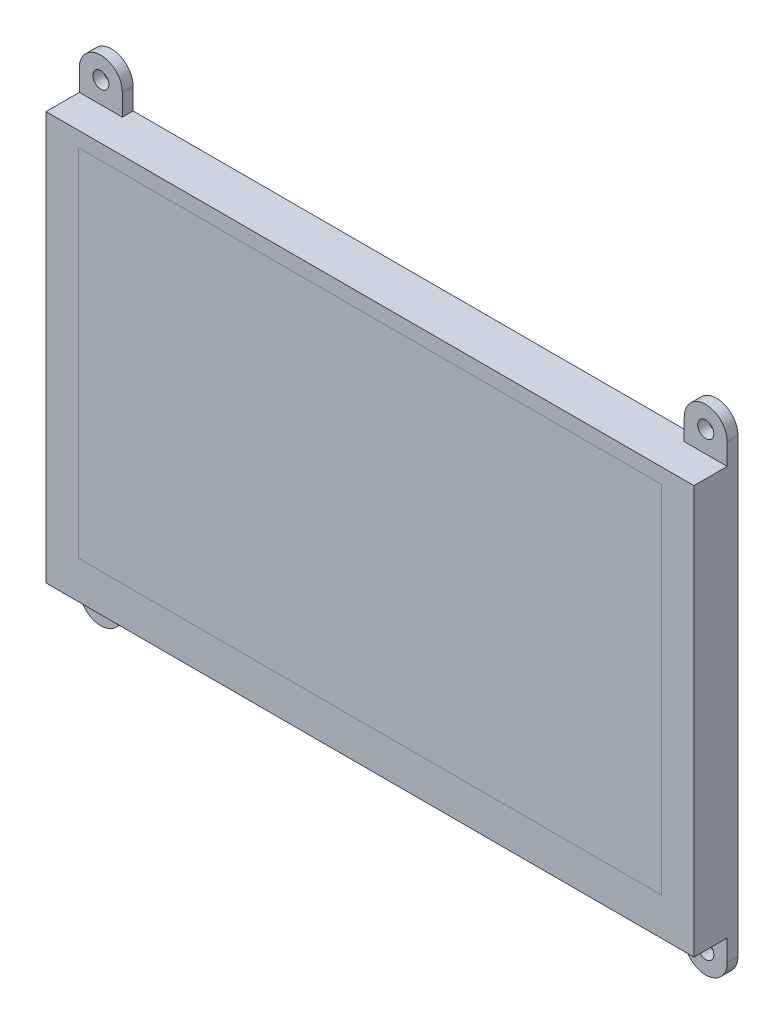
ISO-10303-21;
HEADER;
FILE_DESCRIPTION(('STEP AP214'),'2;1');
FILE_NAME('part.step','',(''),(''),'','','');
FILE_SCHEMA(('AUTOMOTIVE_DESIGN { 1 0 10303 214 1 1 1 1 }'));
ENDSEC;
DATA;
#1=APPLICATION_CONTEXT('core data for automotive mechanical design processes');
#2=APPLICATION_PROTOCOL_DEFINITION('international standard','automotive_design',2000,#1);
#3=PRODUCT_CONTEXT('',#1,'mechanical');
#4=PRODUCT('Part','Part','',(#3));
#5=PRODUCT_RELATED_PRODUCT_CATEGORY('part','',(#4));
#6=PRODUCT_DEFINITION_FORMATION('','',#4);
#7=PRODUCT_DEFINITION_CONTEXT('part definition',#1,'design');
#8=PRODUCT_DEFINITION('design','',#6,#7);
#9=PRODUCT_DEFINITION_SHAPE('','',#8);
#10=(LENGTH_UNIT() NAMED_UNIT(*) SI_UNIT(.MILLI.,.METRE.));
#11=(NAMED_UNIT(*) PLANE_ANGLE_UNIT() SI_UNIT($,.RADIAN.));
#12=(NAMED_UNIT(*) SI_UNIT($,.STERADIAN.) SOLID_ANGLE_UNIT());
#13=UNCERTAINTY_MEASURE_WITH_UNIT(LENGTH_MEASURE(1.E-05),#10,'distance_accuracy_value','');
#14=(GEOMETRIC_REPRESENTATION_CONTEXT(3) GLOBAL_UNCERTAINTY_ASSIGNED_CONTEXT((#13)) GLOBAL_UNIT_ASSIGNED_CONTEXT((#10,
#11,#12)) REPRESENTATION_CONTEXT('',''));
#15=CARTESIAN_POINT('',(0.,0.,0.));
#16=DIRECTION('',(0.,0.,1.));
#17=DIRECTION('',(1.,0.,0.));
#18=AXIS2_PLACEMENT_3D('',#15,#16,#17);
#19=CARTESIAN_POINT('',(0.,0.,8.2));
#20=DIRECTION('',(0.,0.,-1.));
#21=DIRECTION('',(-1.,0.,0.));
#22=AXIS2_PLACEMENT_3D('',#19,#20,#21);
#23=PLANE('',#22);
#24=DIRECTION('',(0.,1.,0.));
#25=VECTOR('',#24,1.);
#26=CARTESIAN_POINT('',(60.3,-38.,8.2));
#27=LINE('',#26,#25);
#28=CARTESIAN_POINT('',(60.3,-38.,8.2));
#29=VERTEX_POINT('',#28);
#30=CARTESIAN_POINT('',(60.3,38.,8.2));
#31=VERTEX_POINT('',#30);
#32=EDGE_CURVE('E171',#29,#31,#27,.T.);
#33=ORIENTED_EDGE('',*,*,#32,.T.);
#34=DIRECTION('',(-1.,0.,0.));
#35=VECTOR('',#34,1.);
#36=CARTESIAN_POINT('',(-60.3,38.,8.2));
#37=LINE('',#36,#35);
#38=CARTESIAN_POINT('',(-60.3,38.,8.2));
#39=VERTEX_POINT('',#38);
#40=EDGE_CURVE('E158',#31,#39,#37,.T.);
#41=ORIENTED_EDGE('',*,*,#40,.T.);
#42=DIRECTION('',(0.,-1.,0.));
#43=VECTOR('',#42,1.);
#44=CARTESIAN_POINT('',(-60.3,-38.,8.2));
#45=LINE('',#44,#43);
#46=CARTESIAN_POINT('',(-60.3,-38.,8.2));
#47=VERTEX_POINT('',#46);
#48=EDGE_CURVE('E170',#39,#47,#45,.T.);
#49=ORIENTED_EDGE('',*,*,#48,.T.);
#50=DIRECTION('',(1.,0.,0.));
#51=VECTOR('',#50,1.);
#52=CARTESIAN_POINT('',(-60.3,-38.,8.2));
#53=LINE('',#52,#51);
#54=EDGE_CURVE('E176',#47,#29,#53,.T.);
#55=ORIENTED_EDGE('',*,*,#54,.T.);
#56=EDGE_LOOP('',(#33,#41,#49,#55));
#57=FACE_BOUND('',#56,.T.);
#58=DIRECTION('',(0.,1.,0.));
#59=VECTOR('',#58,1.);
#60=CARTESIAN_POINT('',(54.3,0.,8.2));
#61=LINE('',#60,#59);
#62=CARTESIAN_POINT('',(54.3,-31.,8.2));
#63=VERTEX_POINT('',#62);
#64=CARTESIAN_POINT('',(54.3,35.2,8.2));
#65=VERTEX_POINT('',#64);
#66=EDGE_CURVE('E11',#63,#65,#61,.T.);
#67=ORIENTED_EDGE('',*,*,#66,.F.);
#68=DIRECTION('',(1.,0.,0.));
#69=VECTOR('',#68,1.);
#70=CARTESIAN_POINT('',(0.,-31.,8.2));
#71=LINE('',#70,#69);
#72=CARTESIAN_POINT('',(-54.3,-31.,8.2));
#73=VERTEX_POINT('',#72);
#74=EDGE_CURVE('E303',#73,#63,#71,.T.);
#75=ORIENTED_EDGE('',*,*,#74,.F.);
#76=DIRECTION('',(0.,-1.,0.));
#77=VECTOR('',#76,1.);
#78=CARTESIAN_POINT('',(-54.3,0.,8.2));
#79=LINE('',#78,#77);
#80=CARTESIAN_POINT('',(-54.3,35.2,8.2));
#81=VERTEX_POINT('',#80);
#82=EDGE_CURVE('E306',#81,#73,#79,.T.);
#83=ORIENTED_EDGE('',*,*,#82,.F.);
#84=DIRECTION('',(-1.,0.,0.));
#85=VECTOR('',#84,1.);
#86=CARTESIAN_POINT('',(0.,35.2,8.2));
#87=LINE('',#86,#85);
#88=EDGE_CURVE('E46',#65,#81,#87,.T.);
#89=ORIENTED_EDGE('',*,*,#88,.F.);
#90=EDGE_LOOP('',(#67,#75,#83,#89));
#91=FACE_BOUND('',#90,.T.);
#92=ADVANCED_FACE('F37',(#57,#91),#23,.F.);
#93=CARTESIAN_POINT('',(0.,0.,2.));
#94=DIRECTION('',(0.,0.,1.));
#95=DIRECTION('',(1.,0.,0.));
#96=AXIS2_PLACEMENT_3D('',#93,#94,#95);
#97=PLANE('',#96);
#98=DIRECTION('',(1.,0.,0.));
#99=VECTOR('',#98,1.);
#100=CARTESIAN_POINT('',(-60.3,-38.,2.));
#101=LINE('',#100,#99);
#102=CARTESIAN_POINT('',(-60.3,-38.,2.));
#103=VERTEX_POINT('',#102);
#104=CARTESIAN_POINT('',(-52.3,-38.,2.));
#105=VERTEX_POINT('',#104);
#106=EDGE_CURVE('E180',#103,#105,#101,.T.);
#107=ORIENTED_EDGE('',*,*,#106,.F.);
#108=DIRECTION('',(0.,1.,0.));
#109=VECTOR('',#108,1.);
#110=CARTESIAN_POINT('',(-60.3,0.,2.));
#111=LINE('',#110,#109);
#112=CARTESIAN_POINT('',(-60.3,-42.,2.));
#113=VERTEX_POINT('',#112);
#114=EDGE_CURVE('E221',#113,#103,#111,.T.);
#115=ORIENTED_EDGE('',*,*,#114,.F.);
#116=CARTESIAN_POINT('',(-56.3,-42.,2.));
#117=DIRECTION('',(0.,0.,1.));
#118=DIRECTION('',(1.,0.,0.));
#119=AXIS2_PLACEMENT_3D('',#116,#117,#118);
#120=CIRCLE('',#119,4.);
#121=CARTESIAN_POINT('',(-52.3,-42.,2.));
#122=VERTEX_POINT('',#121);
#123=EDGE_CURVE('E196',#122,#113,#120,.F.);
#124=ORIENTED_EDGE('',*,*,#123,.F.);
#125=DIRECTION('',(0.,1.,0.));
#126=VECTOR('',#125,1.);
#127=CARTESIAN_POINT('',(-52.3000000000001,-1.81452075587175E-13,2.));
#128=LINE('',#127,#126);
#129=EDGE_CURVE('E199',#122,#105,#128,.T.);
#130=ORIENTED_EDGE('',*,*,#129,.T.);
#131=EDGE_LOOP('',(#107,#115,#124,#130));
#132=FACE_BOUND('',#131,.T.);
#133=CARTESIAN_POINT('',(-56.3,-42.,2.));
#134=DIRECTION('',(0.,0.,1.));
#135=DIRECTION('',(1.,0.,0.));
#136=AXIS2_PLACEMENT_3D('',#133,#134,#135);
#137=CIRCLE('',#136,1.5);
#138=CARTESIAN_POINT('',(-54.8,-42.,2.));
#139=VERTEX_POINT('',#138);
#140=EDGE_CURVE('E230',#139,#139,#137,.F.);
#141=ORIENTED_EDGE('',*,*,#140,.T.);
#142=EDGE_LOOP('',(#141));
#143=FACE_BOUND('',#142,.T.);
#144=ADVANCED_FACE('F321',(#132,#143),#97,.T.);
#145=CARTESIAN_POINT('',(52.3,-38.,2.));
#146=VERTEX_POINT('',#145);
#147=CARTESIAN_POINT('',(60.3,-38.,2.));
#148=VERTEX_POINT('',#147);
#149=EDGE_CURVE('E307',#146,#148,#101,.T.);
#150=ORIENTED_EDGE('',*,*,#149,.F.);
#151=DIRECTION('',(0.,1.,0.));
#152=VECTOR('',#151,1.);
#153=CARTESIAN_POINT('',(52.3000000000002,-1.81452075587175E-13,2.));
#154=LINE('',#153,#152);
#155=CARTESIAN_POINT('',(52.3,-42.,2.));
#156=VERTEX_POINT('',#155);
#157=EDGE_CURVE('E202',#156,#146,#154,.T.);
#158=ORIENTED_EDGE('',*,*,#157,.F.);
#159=CARTESIAN_POINT('',(56.3,-42.,2.));
#160=DIRECTION('',(0.,0.,1.));
#161=DIRECTION('',(1.,0.,0.));
#162=AXIS2_PLACEMENT_3D('',#159,#160,#161);
#163=CIRCLE('',#162,4.);
#164=CARTESIAN_POINT('',(60.3,-42.,2.));
#165=VERTEX_POINT('',#164);
#166=EDGE_CURVE('E205',#156,#165,#163,.T.);
#167=ORIENTED_EDGE('',*,*,#166,.T.);
#168=DIRECTION('',(0.,1.,0.));
#169=VECTOR('',#168,1.);
#170=CARTESIAN_POINT('',(60.3,0.,2.));
#171=LINE('',#170,#169);
#172=EDGE_CURVE('E207',#165,#148,#171,.T.);
#173=ORIENTED_EDGE('',*,*,#172,.T.);
#174=EDGE_LOOP('',(#150,#158,#167,#173));
#175=FACE_BOUND('',#174,.T.);
#176=CARTESIAN_POINT('',(56.3,-42.,2.));
#177=DIRECTION('',(0.,0.,1.));
#178=DIRECTION('',(1.,0.,0.));
#179=AXIS2_PLACEMENT_3D('',#176,#177,#178);
#180=CIRCLE('',#179,1.5);
#181=CARTESIAN_POINT('',(57.8,-42.,2.));
#182=VERTEX_POINT('',#181);
#183=EDGE_CURVE('E233',#182,#182,#180,.T.);
#184=ORIENTED_EDGE('',*,*,#183,.F.);
#185=EDGE_LOOP('',(#184));
#186=FACE_BOUND('',#185,.T.);
#187=ADVANCED_FACE('F326',(#175,#186),#97,.T.);
#188=DIRECTION('',(-1.,0.,0.));
#189=VECTOR('',#188,1.);
#190=CARTESIAN_POINT('',(-60.3,38.,2.));
#191=LINE('',#190,#189);
#192=CARTESIAN_POINT('',(60.3,38.,2.));
#193=VERTEX_POINT('',#192);
#194=CARTESIAN_POINT('',(52.3,38.,2.));
#195=VERTEX_POINT('',#194);
#196=EDGE_CURVE('E423',#193,#195,#191,.T.);
#197=ORIENTED_EDGE('',*,*,#196,.F.);
#198=CARTESIAN_POINT('',(60.3,42.,2.));
#199=VERTEX_POINT('',#198);
#200=EDGE_CURVE('E186',#193,#199,#171,.T.);
#201=ORIENTED_EDGE('',*,*,#200,.T.);
#202=CARTESIAN_POINT('',(56.3,42.,2.));
#203=DIRECTION('',(0.,0.,1.));
#204=DIRECTION('',(1.,0.,0.));
#205=AXIS2_PLACEMENT_3D('',#202,#203,#204);
#206=CIRCLE('',#205,4.);
#207=CARTESIAN_POINT('',(52.3,42.,2.));
#208=VERTEX_POINT('',#207);
#209=EDGE_CURVE('E209',#208,#199,#206,.F.);
#210=ORIENTED_EDGE('',*,*,#209,.F.);
#211=DIRECTION('',(0.,-1.,0.));
#212=VECTOR('',#211,1.);
#213=CARTESIAN_POINT('',(52.3000000000002,1.81452075587175E-13,2.));
#214=LINE('',#213,#212);
#215=EDGE_CURVE('E212',#208,#195,#214,.T.);
#216=ORIENTED_EDGE('',*,*,#215,.T.);
#217=EDGE_LOOP('',(#197,#201,#210,#216));
#218=FACE_BOUND('',#217,.T.);
#219=CARTESIAN_POINT('',(56.3,42.,2.));
#220=DIRECTION('',(0.,0.,1.));
#221=DIRECTION('',(1.,0.,0.));
#222=AXIS2_PLACEMENT_3D('',#219,#220,#221);
#223=CIRCLE('',#222,1.5);
#224=CARTESIAN_POINT('',(57.8,42.,2.));
#225=VERTEX_POINT('',#224);
#226=EDGE_CURVE('E227',#225,#225,#223,.F.);
#227=ORIENTED_EDGE('',*,*,#226,.T.);
#228=EDGE_LOOP('',(#227));
#229=FACE_BOUND('',#228,.T.);
#230=ADVANCED_FACE('F342',(#218,#229),#97,.T.);
#231=CARTESIAN_POINT('',(-56.3,-42.,2.));
#232=DIRECTION('',(0.,0.,-1.));
#233=DIRECTION('',(-1.,0.,0.));
#234=AXIS2_PLACEMENT_3D('',#231,#232,#233);
#235=CYLINDRICAL_SURFACE('',#234,4.);
#236=CARTESIAN_POINT('',(-56.3,-42.,0.));
#237=DIRECTION('',(0.,0.,1.));
#238=DIRECTION('',(1.,0.,0.));
#239=AXIS2_PLACEMENT_3D('',#236,#237,#238);
#240=CIRCLE('',#239,4.);
#241=CARTESIAN_POINT('',(-52.3,-42.,0.));
#242=VERTEX_POINT('',#241);
#243=CARTESIAN_POINT('',(-60.3,-42.,0.));
#244=VERTEX_POINT('',#243);
#245=EDGE_CURVE('E187',#242,#244,#240,.F.);
#246=ORIENTED_EDGE('',*,*,#245,.F.);
#247=DIRECTION('',(0.,0.,-1.));
#248=VECTOR('',#247,1.);
#249=CARTESIAN_POINT('',(-52.3,-42.,2.));
#250=LINE('',#249,#248);
#251=EDGE_CURVE('E300',#122,#242,#250,.T.);
#252=ORIENTED_EDGE('',*,*,#251,.F.);
#253=ORIENTED_EDGE('',*,*,#123,.T.);
#254=DIRECTION('',(0.,0.,-1.));
#255=VECTOR('',#254,1.);
#256=CARTESIAN_POINT('',(-60.3,-42.,2.));
#257=LINE('',#256,#255);
#258=EDGE_CURVE('E235',#113,#244,#257,.T.);
#259=ORIENTED_EDGE('',*,*,#258,.T.);
#260=EDGE_LOOP('',(#246,#252,#253,#259));
#261=FACE_BOUND('',#260,.T.);
#262=ADVANCED_FACE('F39',(#261),#235,.T.);
#263=CARTESIAN_POINT('',(-52.3000000000001,-1.81452075587175E-13,2.));
#264=DIRECTION('',(-1.,0.,0.));
#265=DIRECTION('',(0.,-1.,0.));
#266=AXIS2_PLACEMENT_3D('',#263,#264,#265);
#267=PLANE('',#266);
#268=DIRECTION('',(0.,1.,0.));
#269=VECTOR('',#268,1.);
#270=CARTESIAN_POINT('',(-52.3000000000001,-1.81452075587175E-13,0.));
#271=LINE('',#270,#269);
#272=CARTESIAN_POINT('',(-52.3,-38.,0.));
#273=VERTEX_POINT('',#272);
#274=EDGE_CURVE('E190',#242,#273,#271,.T.);
#275=ORIENTED_EDGE('',*,*,#274,.T.);
#276=DIRECTION('',(0.,0.,-1.));
#277=VECTOR('',#276,1.);
#278=CARTESIAN_POINT('',(-52.3,-38.,2.));
#279=LINE('',#278,#277);
#280=EDGE_CURVE('E297',#105,#273,#279,.T.);
#281=ORIENTED_EDGE('',*,*,#280,.F.);
#282=ORIENTED_EDGE('',*,*,#129,.F.);
#283=ORIENTED_EDGE('',*,*,#251,.T.);
#284=EDGE_LOOP('',(#275,#281,#282,#283));
#285=FACE_BOUND('',#284,.T.);
#286=ADVANCED_FACE('F394',(#285),#267,.F.);
#287=CARTESIAN_POINT('',(0.,-38.,2.));
#288=DIRECTION('',(0.,1.,0.));
#289=DIRECTION('',(0.,0.,1.));
#290=AXIS2_PLACEMENT_3D('',#287,#288,#289);
#291=PLANE('',#290);
#292=DIRECTION('',(1.,0.,0.));
#293=VECTOR('',#292,1.);
#294=CARTESIAN_POINT('',(0.,-38.,0.));
#295=LINE('',#294,#293);
#296=CARTESIAN_POINT('',(52.3,-38.,0.));
#297=VERTEX_POINT('',#296);
#298=EDGE_CURVE('E238',#273,#297,#295,.T.);
#299=ORIENTED_EDGE('',*,*,#298,.T.);
#300=DIRECTION('',(0.,0.,-1.));
#301=VECTOR('',#300,1.);
#302=CARTESIAN_POINT('',(52.3,-38.,2.));
#303=LINE('',#302,#301);
#304=EDGE_CURVE('E295',#146,#297,#303,.T.);
#305=ORIENTED_EDGE('',*,*,#304,.F.);
#306=ORIENTED_EDGE('',*,*,#149,.T.);
#307=DIRECTION('',(0.,0.,-1.));
#308=VECTOR('',#307,1.);
#309=CARTESIAN_POINT('',(60.3,-38.,8.2));
#310=LINE('',#309,#308);
#311=EDGE_CURVE('E416',#29,#148,#310,.T.);
#312=ORIENTED_EDGE('',*,*,#311,.F.);
#313=ORIENTED_EDGE('',*,*,#54,.F.);
#314=DIRECTION('',(0.,0.,-1.));
#315=VECTOR('',#314,1.);
#316=CARTESIAN_POINT('',(-60.3,-38.,8.2));
#317=LINE('',#316,#315);
#318=EDGE_CURVE('E192',#47,#103,#317,.T.);
#319=ORIENTED_EDGE('',*,*,#318,.T.);
#320=ORIENTED_EDGE('',*,*,#106,.T.);
#321=ORIENTED_EDGE('',*,*,#280,.T.);
#322=EDGE_LOOP('',(#299,#305,#306,#312,#313,#319,#320,#321));
#323=FACE_BOUND('',#322,.T.);
#324=ADVANCED_FACE('F391',(#323),#291,.F.);
#325=CARTESIAN_POINT('',(52.3000000000002,-1.81452075587175E-13,2.));
#326=DIRECTION('',(-1.,0.,0.));
#327=DIRECTION('',(0.,-1.,0.));
#328=AXIS2_PLACEMENT_3D('',#325,#326,#327);
#329=PLANE('',#328);
#330=DIRECTION('',(0.,1.,0.));
#331=VECTOR('',#330,1.);
#332=CARTESIAN_POINT('',(52.3000000000002,-1.81452075587175E-13,0.));
#333=LINE('',#332,#331);
#334=CARTESIAN_POINT('',(52.3,-42.,0.));
#335=VERTEX_POINT('',#334);
#336=EDGE_CURVE('E241',#335,#297,#333,.T.);
#337=ORIENTED_EDGE('',*,*,#336,.F.);
#338=DIRECTION('',(0.,0.,-1.));
#339=VECTOR('',#338,1.);
#340=CARTESIAN_POINT('',(52.3,-42.,2.));
#341=LINE('',#340,#339);
#342=EDGE_CURVE('E293',#156,#335,#341,.T.);
#343=ORIENTED_EDGE('',*,*,#342,.F.);
#344=ORIENTED_EDGE('',*,*,#157,.T.);
#345=ORIENTED_EDGE('',*,*,#304,.T.);
#346=EDGE_LOOP('',(#337,#343,#344,#345));
#347=FACE_BOUND('',#346,.T.);
#348=ADVANCED_FACE('F387',(#347),#329,.T.);
#349=CARTESIAN_POINT('',(56.3,-42.,2.));
#350=DIRECTION('',(0.,0.,-1.));
#351=DIRECTION('',(-1.,0.,0.));
#352=AXIS2_PLACEMENT_3D('',#349,#350,#351);
#353=CYLINDRICAL_SURFACE('',#352,4.);
#354=CARTESIAN_POINT('',(56.3,-42.,0.));
#355=DIRECTION('',(0.,0.,1.));
#356=DIRECTION('',(1.,0.,0.));
#357=AXIS2_PLACEMENT_3D('',#354,#355,#356);
#358=CIRCLE('',#357,4.);
#359=CARTESIAN_POINT('',(60.3,-42.,0.));
#360=VERTEX_POINT('',#359);
#361=EDGE_CURVE('E244',#335,#360,#358,.T.);
#362=ORIENTED_EDGE('',*,*,#361,.T.);
#363=DIRECTION('',(0.,0.,-1.));
#364=VECTOR('',#363,1.);
#365=CARTESIAN_POINT('',(60.3,-42.,2.));
#366=LINE('',#365,#364);
#367=EDGE_CURVE('E290',#165,#360,#366,.T.);
#368=ORIENTED_EDGE('',*,*,#367,.F.);
#369=ORIENTED_EDGE('',*,*,#166,.F.);
#370=ORIENTED_EDGE('',*,*,#342,.T.);
#371=EDGE_LOOP('',(#362,#368,#369,#370));
#372=FACE_BOUND('',#371,.T.);
#373=ADVANCED_FACE('F384',(#372),#353,.T.);
#374=CARTESIAN_POINT('',(60.3,0.,2.));
#375=DIRECTION('',(-1.,0.,0.));
#376=DIRECTION('',(0.,0.,1.));
#377=AXIS2_PLACEMENT_3D('',#374,#375,#376);
#378=PLANE('',#377);
#379=DIRECTION('',(0.,1.,0.));
#380=VECTOR('',#379,1.);
#381=CARTESIAN_POINT('',(60.3,0.,0.));
#382=LINE('',#381,#380);
#383=CARTESIAN_POINT('',(60.3,42.,0.));
#384=VERTEX_POINT('',#383);
#385=EDGE_CURVE('E246',#360,#384,#382,.T.);
#386=ORIENTED_EDGE('',*,*,#385,.T.);
#387=DIRECTION('',(0.,0.,-1.));
#388=VECTOR('',#387,1.);
#389=CARTESIAN_POINT('',(60.3,42.,2.));
#390=LINE('',#389,#388);
#391=EDGE_CURVE('E288',#199,#384,#390,.T.);
#392=ORIENTED_EDGE('',*,*,#391,.F.);
#393=ORIENTED_EDGE('',*,*,#200,.F.);
#394=DIRECTION('',(0.,0.,-1.));
#395=VECTOR('',#394,1.);
#396=CARTESIAN_POINT('',(60.3,38.,8.2));
#397=LINE('',#396,#395);
#398=EDGE_CURVE('E164',#31,#193,#397,.T.);
#399=ORIENTED_EDGE('',*,*,#398,.F.);
#400=ORIENTED_EDGE('',*,*,#32,.F.);
#401=ORIENTED_EDGE('',*,*,#311,.T.);
#402=ORIENTED_EDGE('',*,*,#172,.F.);
#403=ORIENTED_EDGE('',*,*,#367,.T.);
#404=EDGE_LOOP('',(#386,#392,#393,#399,#400,#401,#402,#403));
#405=FACE_BOUND('',#404,.T.);
#406=ADVANCED_FACE('F184',(#405),#378,.F.);
#407=CARTESIAN_POINT('',(56.3,42.,2.));
#408=DIRECTION('',(0.,0.,-1.));
#409=DIRECTION('',(-1.,0.,0.));
#410=AXIS2_PLACEMENT_3D('',#407,#408,#409);
#411=CYLINDRICAL_SURFACE('',#410,4.);
#412=CARTESIAN_POINT('',(56.3,42.,0.));
#413=DIRECTION('',(0.,0.,1.));
#414=DIRECTION('',(1.,0.,0.));
#415=AXIS2_PLACEMENT_3D('',#412,#413,#414);
#416=CIRCLE('',#415,4.);
#417=CARTESIAN_POINT('',(52.3,42.,0.));
#418=VERTEX_POINT('',#417);
#419=EDGE_CURVE('E248',#418,#384,#416,.F.);
#420=ORIENTED_EDGE('',*,*,#419,.F.);
#421=DIRECTION('',(0.,0.,-1.));
#422=VECTOR('',#421,1.);
#423=CARTESIAN_POINT('',(52.3,42.,2.));
#424=LINE('',#423,#422);
#425=EDGE_CURVE('E286',#208,#418,#424,.T.);
#426=ORIENTED_EDGE('',*,*,#425,.F.);
#427=ORIENTED_EDGE('',*,*,#209,.T.);
#428=ORIENTED_EDGE('',*,*,#391,.T.);
#429=EDGE_LOOP('',(#420,#426,#427,#428));
#430=FACE_BOUND('',#429,.T.);
#431=ADVANCED_FACE('F377',(#430),#411,.T.);
#432=CARTESIAN_POINT('',(52.3000000000002,1.81452075587175E-13,2.));
#433=DIRECTION('',(1.,0.,0.));
#434=DIRECTION('',(0.,1.,0.));
#435=AXIS2_PLACEMENT_3D('',#432,#433,#434);
#436=PLANE('',#435);
#437=DIRECTION('',(0.,-1.,0.));
#438=VECTOR('',#437,1.);
#439=CARTESIAN_POINT('',(52.3000000000002,1.81452075587175E-13,0.));
#440=LINE('',#439,#438);
#441=CARTESIAN_POINT('',(52.3,38.,0.));
#442=VERTEX_POINT('',#441);
#443=EDGE_CURVE('E251',#418,#442,#440,.T.);
#444=ORIENTED_EDGE('',*,*,#443,.T.);
#445=DIRECTION('',(0.,0.,-1.));
#446=VECTOR('',#445,1.);
#447=CARTESIAN_POINT('',(52.3,38.,2.));
#448=LINE('',#447,#446);
#449=EDGE_CURVE('E284',#195,#442,#448,.T.);
#450=ORIENTED_EDGE('',*,*,#449,.F.);
#451=ORIENTED_EDGE('',*,*,#215,.F.);
#452=ORIENTED_EDGE('',*,*,#425,.T.);
#453=EDGE_LOOP('',(#444,#450,#451,#452));
#454=FACE_BOUND('',#453,.T.);
#455=ADVANCED_FACE('F374',(#454),#436,.F.);
#456=CARTESIAN_POINT('',(0.,38.,2.));
#457=DIRECTION('',(0.,1.,0.));
#458=DIRECTION('',(0.,0.,1.));
#459=AXIS2_PLACEMENT_3D('',#456,#457,#458);
#460=PLANE('',#459);
#461=DIRECTION('',(1.,0.,0.));
#462=VECTOR('',#461,1.);
#463=CARTESIAN_POINT('',(0.,38.,0.));
#464=LINE('',#463,#462);
#465=CARTESIAN_POINT('',(-52.3,38.,0.));
#466=VERTEX_POINT('',#465);
#467=EDGE_CURVE('E254',#466,#442,#464,.T.);
#468=ORIENTED_EDGE('',*,*,#467,.F.);
#469=DIRECTION('',(0.,0.,-1.));
#470=VECTOR('',#469,1.);
#471=CARTESIAN_POINT('',(-52.3,38.,2.));
#472=LINE('',#471,#470);
#473=CARTESIAN_POINT('',(-52.3,38.,2.));
#474=VERTEX_POINT('',#473);
#475=EDGE_CURVE('E282',#474,#466,#472,.T.);
#476=ORIENTED_EDGE('',*,*,#475,.F.);
#477=CARTESIAN_POINT('',(-60.3,38.,2.));
#478=VERTEX_POINT('',#477);
#479=EDGE_CURVE('E302',#474,#478,#191,.T.);
#480=ORIENTED_EDGE('',*,*,#479,.T.);
#481=DIRECTION('',(0.,0.,-1.));
#482=VECTOR('',#481,1.);
#483=CARTESIAN_POINT('',(-60.3,38.,8.2));
#484=LINE('',#483,#482);
#485=EDGE_CURVE('E167',#39,#478,#484,.T.);
#486=ORIENTED_EDGE('',*,*,#485,.F.);
#487=ORIENTED_EDGE('',*,*,#40,.F.);
#488=ORIENTED_EDGE('',*,*,#398,.T.);
#489=ORIENTED_EDGE('',*,*,#196,.T.);
#490=ORIENTED_EDGE('',*,*,#449,.T.);
#491=EDGE_LOOP('',(#468,#476,#480,#486,#487,#488,#489,#490));
#492=FACE_BOUND('',#491,.T.);
#493=ADVANCED_FACE('F161',(#492),#460,.T.);
#494=CARTESIAN_POINT('',(-52.3000000000001,1.81452075587175E-13,2.));
#495=DIRECTION('',(1.,0.,0.));
#496=DIRECTION('',(0.,1.,0.));
#497=AXIS2_PLACEMENT_3D('',#494,#495,#496);
#498=PLANE('',#497);
#499=DIRECTION('',(0.,-1.,0.));
#500=VECTOR('',#499,1.);
#501=CARTESIAN_POINT('',(-52.3000000000001,1.81452075587175E-13,0.));
#502=LINE('',#501,#500);
#503=CARTESIAN_POINT('',(-52.3,42.,0.));
#504=VERTEX_POINT('',#503);
#505=EDGE_CURVE('E257',#504,#466,#502,.T.);
#506=ORIENTED_EDGE('',*,*,#505,.F.);
#507=DIRECTION('',(0.,0.,-1.));
#508=VECTOR('',#507,1.);
#509=CARTESIAN_POINT('',(-52.3,42.,2.));
#510=LINE('',#509,#508);
#511=CARTESIAN_POINT('',(-52.3,42.,2.));
#512=VERTEX_POINT('',#511);
#513=EDGE_CURVE('E280',#512,#504,#510,.T.);
#514=ORIENTED_EDGE('',*,*,#513,.F.);
#515=DIRECTION('',(0.,-1.,0.));
#516=VECTOR('',#515,1.);
#517=CARTESIAN_POINT('',(-52.3000000000001,1.81452075587175E-13,2.));
#518=LINE('',#517,#516);
#519=EDGE_CURVE('E214',#512,#474,#518,.T.);
#520=ORIENTED_EDGE('',*,*,#519,.T.);
#521=ORIENTED_EDGE('',*,*,#475,.T.);
#522=EDGE_LOOP('',(#506,#514,#520,#521));
#523=FACE_BOUND('',#522,.T.);
#524=ADVANCED_FACE('F367',(#523),#498,.T.);
#525=CARTESIAN_POINT('',(-56.3,42.,2.));
#526=DIRECTION('',(0.,0.,-1.));
#527=DIRECTION('',(-1.,0.,0.));
#528=AXIS2_PLACEMENT_3D('',#525,#526,#527);
#529=CYLINDRICAL_SURFACE('',#528,4.);
#530=CARTESIAN_POINT('',(-56.3,42.,0.));
#531=DIRECTION('',(0.,0.,1.));
#532=DIRECTION('',(1.,0.,0.));
#533=AXIS2_PLACEMENT_3D('',#530,#531,#532);
#534=CIRCLE('',#533,4.);
#535=CARTESIAN_POINT('',(-60.3,42.,0.));
#536=VERTEX_POINT('',#535);
#537=EDGE_CURVE('E260',#504,#536,#534,.T.);
#538=ORIENTED_EDGE('',*,*,#537,.T.);
#539=DIRECTION('',(0.,0.,-1.));
#540=VECTOR('',#539,1.);
#541=CARTESIAN_POINT('',(-60.3,42.,2.));
#542=LINE('',#541,#540);
#543=CARTESIAN_POINT('',(-60.3,42.,2.));
#544=VERTEX_POINT('',#543);
#545=EDGE_CURVE('E278',#544,#536,#542,.T.);
#546=ORIENTED_EDGE('',*,*,#545,.F.);
#547=CARTESIAN_POINT('',(-56.3,42.,2.));
#548=DIRECTION('',(0.,0.,1.));
#549=DIRECTION('',(1.,0.,0.));
#550=AXIS2_PLACEMENT_3D('',#547,#548,#549);
#551=CIRCLE('',#550,4.);
#552=EDGE_CURVE('E217',#512,#544,#551,.T.);
#553=ORIENTED_EDGE('',*,*,#552,.F.);
#554=ORIENTED_EDGE('',*,*,#513,.T.);
#555=EDGE_LOOP('',(#538,#546,#553,#554));
#556=FACE_BOUND('',#555,.T.);
#557=ADVANCED_FACE('F353',(#556),#529,.T.);
#558=CARTESIAN_POINT('',(-56.3,-42.,2.));
#559=DIRECTION('',(0.,0.,-1.));
#560=DIRECTION('',(-1.,0.,0.));
#561=AXIS2_PLACEMENT_3D('',#558,#559,#560);
#562=CYLINDRICAL_SURFACE('',#561,1.5);
#563=ORIENTED_EDGE('',*,*,#140,.F.);
#564=EDGE_LOOP('',(#563));
#565=FACE_BOUND('',#564,.T.);
#566=CARTESIAN_POINT('',(-56.3,-42.,0.));
#567=DIRECTION('',(0.,0.,1.));
#568=DIRECTION('',(1.,0.,0.));
#569=AXIS2_PLACEMENT_3D('',#566,#567,#568);
#570=CIRCLE('',#569,1.5);
#571=CARTESIAN_POINT('',(-54.8,-42.,0.));
#572=VERTEX_POINT('',#571);
#573=EDGE_CURVE('E272',#572,#572,#570,.F.);
#574=ORIENTED_EDGE('',*,*,#573,.T.);
#575=EDGE_LOOP('',(#574));
#576=FACE_BOUND('',#575,.T.);
#577=ADVANCED_FACE('F349',(#565,#576),#562,.F.);
#578=CARTESIAN_POINT('',(56.3,42.,2.));
#579=DIRECTION('',(0.,0.,-1.));
#580=DIRECTION('',(-1.,0.,0.));
#581=AXIS2_PLACEMENT_3D('',#578,#579,#580);
#582=CYLINDRICAL_SURFACE('',#581,1.5);
#583=ORIENTED_EDGE('',*,*,#226,.F.);
#584=EDGE_LOOP('',(#583));
#585=FACE_BOUND('',#584,.T.);
#586=CARTESIAN_POINT('',(56.3,42.,0.));
#587=DIRECTION('',(0.,0.,1.));
#588=DIRECTION('',(1.,0.,0.));
#589=AXIS2_PLACEMENT_3D('',#586,#587,#588);
#590=CIRCLE('',#589,1.5);
#591=CARTESIAN_POINT('',(57.8,42.,0.));
#592=VERTEX_POINT('',#591);
#593=EDGE_CURVE('E269',#592,#592,#590,.F.);
#594=ORIENTED_EDGE('',*,*,#593,.T.);
#595=EDGE_LOOP('',(#594));
#596=FACE_BOUND('',#595,.T.);
#597=ADVANCED_FACE('F352',(#585,#596),#582,.F.);
#598=CARTESIAN_POINT('',(-56.3,42.,2.));
#599=DIRECTION('',(0.,0.,-1.));
#600=DIRECTION('',(-1.,0.,0.));
#601=AXIS2_PLACEMENT_3D('',#598,#599,#600);
#602=CYLINDRICAL_SURFACE('',#601,1.5);
#603=CARTESIAN_POINT('',(-56.3,42.,2.));
#604=DIRECTION('',(0.,0.,1.));
#605=DIRECTION('',(1.,0.,0.));
#606=AXIS2_PLACEMENT_3D('',#603,#604,#605);
#607=CIRCLE('',#606,1.5);
#608=CARTESIAN_POINT('',(-54.8,42.,2.));
#609=VERTEX_POINT('',#608);
#610=EDGE_CURVE('E224',#609,#609,#607,.T.);
#611=ORIENTED_EDGE('',*,*,#610,.T.);
#612=EDGE_LOOP('',(#611));
#613=FACE_BOUND('',#612,.T.);
#614=CARTESIAN_POINT('',(-56.3,42.,0.));
#615=DIRECTION('',(0.,0.,1.));
#616=DIRECTION('',(1.,0.,0.));
#617=AXIS2_PLACEMENT_3D('',#614,#615,#616);
#618=CIRCLE('',#617,1.5);
#619=CARTESIAN_POINT('',(-54.8,42.,0.));
#620=VERTEX_POINT('',#619);
#621=EDGE_CURVE('E266',#620,#620,#618,.T.);
#622=ORIENTED_EDGE('',*,*,#621,.F.);
#623=EDGE_LOOP('',(#622));
#624=FACE_BOUND('',#623,.T.);
#625=ADVANCED_FACE('F357',(#613,#624),#602,.F.);
#626=CARTESIAN_POINT('',(-60.3,0.,2.));
#627=DIRECTION('',(-1.,0.,0.));
#628=DIRECTION('',(0.,0.,1.));
#629=AXIS2_PLACEMENT_3D('',#626,#627,#628);
#630=PLANE('',#629);
#631=DIRECTION('',(0.,1.,0.));
#632=VECTOR('',#631,1.);
#633=CARTESIAN_POINT('',(-60.3,0.,0.));
#634=LINE('',#633,#632);
#635=EDGE_CURVE('E263',#244,#536,#634,.T.);
#636=ORIENTED_EDGE('',*,*,#635,.F.);
#637=ORIENTED_EDGE('',*,*,#258,.F.);
#638=ORIENTED_EDGE('',*,*,#114,.T.);
#639=ORIENTED_EDGE('',*,*,#318,.F.);
#640=ORIENTED_EDGE('',*,*,#48,.F.);
#641=ORIENTED_EDGE('',*,*,#485,.T.);
#642=EDGE_CURVE('E220',#478,#544,#111,.T.);
#643=ORIENTED_EDGE('',*,*,#642,.T.);
#644=ORIENTED_EDGE('',*,*,#545,.T.);
#645=EDGE_LOOP('',(#636,#637,#638,#639,#640,#641,#643,#644));
#646=FACE_BOUND('',#645,.T.);
#647=ADVANCED_FACE('F347',(#646),#630,.T.);
#648=CARTESIAN_POINT('',(56.3,-42.,2.));
#649=DIRECTION('',(0.,0.,-1.));
#650=DIRECTION('',(-1.,0.,0.));
#651=AXIS2_PLACEMENT_3D('',#648,#649,#650);
#652=CYLINDRICAL_SURFACE('',#651,1.5);
#653=ORIENTED_EDGE('',*,*,#183,.T.);
#654=EDGE_LOOP('',(#653));
#655=FACE_BOUND('',#654,.T.);
#656=CARTESIAN_POINT('',(56.3,-42.,0.));
#657=DIRECTION('',(0.,0.,1.));
#658=DIRECTION('',(1.,0.,0.));
#659=AXIS2_PLACEMENT_3D('',#656,#657,#658);
#660=CIRCLE('',#659,1.5);
#661=CARTESIAN_POINT('',(57.8,-42.,0.));
#662=VERTEX_POINT('',#661);
#663=EDGE_CURVE('E200',#662,#662,#660,.T.);
#664=ORIENTED_EDGE('',*,*,#663,.F.);
#665=EDGE_LOOP('',(#664));
#666=FACE_BOUND('',#665,.T.);
#667=ADVANCED_FACE('F340',(#655,#666),#652,.F.);
#668=ORIENTED_EDGE('',*,*,#479,.F.);
#669=ORIENTED_EDGE('',*,*,#519,.F.);
#670=ORIENTED_EDGE('',*,*,#552,.T.);
#671=ORIENTED_EDGE('',*,*,#642,.F.);
#672=EDGE_LOOP('',(#668,#669,#670,#671));
#673=FACE_BOUND('',#672,.T.);
#674=ORIENTED_EDGE('',*,*,#610,.F.);
#675=EDGE_LOOP('',(#674));
#676=FACE_BOUND('',#675,.T.);
#677=ADVANCED_FACE('F329',(#673,#676),#97,.T.);
#678=CARTESIAN_POINT('',(0.,0.,0.));
#679=DIRECTION('',(0.,0.,1.));
#680=DIRECTION('',(1.,0.,0.));
#681=AXIS2_PLACEMENT_3D('',#678,#679,#680);
#682=PLANE('',#681);
#683=ORIENTED_EDGE('',*,*,#245,.T.);
#684=ORIENTED_EDGE('',*,*,#635,.T.);
#685=ORIENTED_EDGE('',*,*,#537,.F.);
#686=ORIENTED_EDGE('',*,*,#505,.T.);
#687=ORIENTED_EDGE('',*,*,#467,.T.);
#688=ORIENTED_EDGE('',*,*,#443,.F.);
#689=ORIENTED_EDGE('',*,*,#419,.T.);
#690=ORIENTED_EDGE('',*,*,#385,.F.);
#691=ORIENTED_EDGE('',*,*,#361,.F.);
#692=ORIENTED_EDGE('',*,*,#336,.T.);
#693=ORIENTED_EDGE('',*,*,#298,.F.);
#694=ORIENTED_EDGE('',*,*,#274,.F.);
#695=EDGE_LOOP('',(#683,#684,#685,#686,#687,#688,#689,#690,#691,#692,#693,#694));
#696=FACE_BOUND('',#695,.T.);
#697=ORIENTED_EDGE('',*,*,#621,.T.);
#698=EDGE_LOOP('',(#697));
#699=FACE_BOUND('',#698,.T.);
#700=ORIENTED_EDGE('',*,*,#593,.F.);
#701=EDGE_LOOP('',(#700));
#702=FACE_BOUND('',#701,.T.);
#703=ORIENTED_EDGE('',*,*,#573,.F.);
#704=EDGE_LOOP('',(#703));
#705=FACE_BOUND('',#704,.T.);
#706=ORIENTED_EDGE('',*,*,#663,.T.);
#707=EDGE_LOOP('',(#706));
#708=FACE_BOUND('',#707,.T.);
#709=ADVANCED_FACE('F331',(#696,#699,#702,#705,#708),#682,.F.);
#710=ORIENTED_EDGE('',*,*,#74,.T.);
#711=ORIENTED_EDGE('',*,*,#66,.T.);
#712=ORIENTED_EDGE('',*,*,#88,.T.);
#713=ORIENTED_EDGE('',*,*,#82,.T.);
#714=EDGE_LOOP('',(#710,#711,#712,#713));
#715=FACE_BOUND('',#714,.T.);
#716=ADVANCED_FACE('F319',(#715),#23,.F.);
#717=CLOSED_SHELL('',(#92,#144,#187,#230,#262,#286,#324,#348,#373,#406,#431,#455,#493,#524,#557,
#577,#597,#625,#647,#667,#677,#709,#716));
#718=MANIFOLD_SOLID_BREP('B2',#717);
#719=ADVANCED_BREP_SHAPE_REPRESENTATION('',(#18,#718),#14);
#720=SHAPE_DEFINITION_REPRESENTATION(#9,#719);
ENDSEC;
END-ISO-10303-21;
